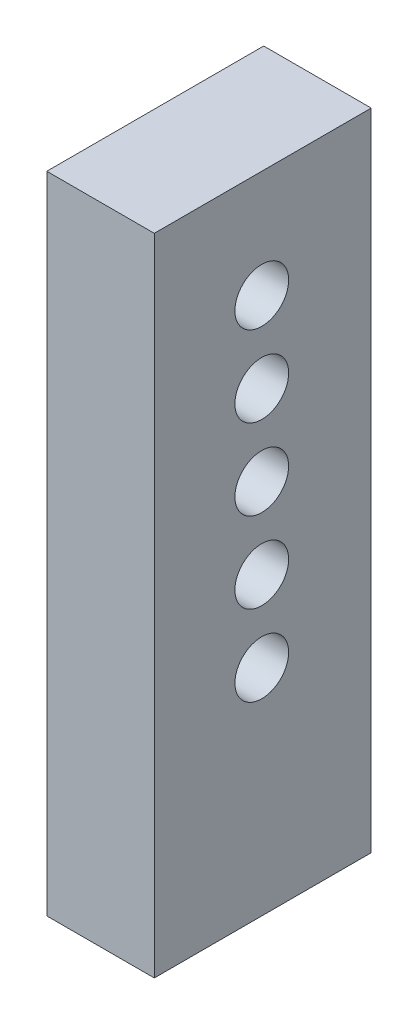
ISO-10303-21;
HEADER;
FILE_DESCRIPTION(('STEP AP214'),'2;1');
FILE_NAME('part.step','',(''),(''),'','','');
FILE_SCHEMA(('AUTOMOTIVE_DESIGN { 1 0 10303 214 1 1 1 1 }'));
ENDSEC;
DATA;
#1=APPLICATION_CONTEXT('core data for automotive mechanical design processes');
#2=APPLICATION_PROTOCOL_DEFINITION('international standard','automotive_design',2000,#1);
#3=PRODUCT_CONTEXT('',#1,'mechanical');
#4=PRODUCT('Part','Part','',(#3));
#5=PRODUCT_RELATED_PRODUCT_CATEGORY('part','',(#4));
#6=PRODUCT_DEFINITION_FORMATION('','',#4);
#7=PRODUCT_DEFINITION_CONTEXT('part definition',#1,'design');
#8=PRODUCT_DEFINITION('design','',#6,#7);
#9=PRODUCT_DEFINITION_SHAPE('','',#8);
#10=(LENGTH_UNIT() NAMED_UNIT(*) SI_UNIT(.MILLI.,.METRE.));
#11=(NAMED_UNIT(*) PLANE_ANGLE_UNIT() SI_UNIT($,.RADIAN.));
#12=(NAMED_UNIT(*) SI_UNIT($,.STERADIAN.) SOLID_ANGLE_UNIT());
#13=UNCERTAINTY_MEASURE_WITH_UNIT(LENGTH_MEASURE(1.E-05),#10,'distance_accuracy_value','');
#14=(GEOMETRIC_REPRESENTATION_CONTEXT(3) GLOBAL_UNCERTAINTY_ASSIGNED_CONTEXT((#13)) GLOBAL_UNIT_ASSIGNED_CONTEXT((#10,
#11,#12)) REPRESENTATION_CONTEXT('',''));
#15=CARTESIAN_POINT('',(0.,0.,0.));
#16=DIRECTION('',(0.,0.,1.));
#17=DIRECTION('',(1.,0.,0.));
#18=AXIS2_PLACEMENT_3D('',#15,#16,#17);
#19=CARTESIAN_POINT('',(25.4,0.,0.));
#20=DIRECTION('',(-1.,0.,0.));
#21=DIRECTION('',(0.,0.,1.));
#22=AXIS2_PLACEMENT_3D('',#19,#20,#21);
#23=PLANE('',#22);
#24=DIRECTION('',(0.,1.,0.));
#25=VECTOR('',#24,1.);
#26=CARTESIAN_POINT('',(25.4,0.,50.3395693192298));
#27=LINE('',#26,#25);
#28=CARTESIAN_POINT('',(25.4,0.,50.3395693192298));
#29=VERTEX_POINT('',#28);
#30=CARTESIAN_POINT('',(25.4,152.4,50.3395693192298));
#31=VERTEX_POINT('',#30);
#32=EDGE_CURVE('E85',#29,#31,#27,.T.);
#33=ORIENTED_EDGE('',*,*,#32,.T.);
#34=DIRECTION('',(0.,0.,1.));
#35=VECTOR('',#34,1.);
#36=CARTESIAN_POINT('',(25.4,152.4,101.6));
#37=LINE('',#36,#35);
#38=CARTESIAN_POINT('',(25.4,152.4,101.6));
#39=VERTEX_POINT('',#38);
#40=EDGE_CURVE('E80',#31,#39,#37,.T.);
#41=ORIENTED_EDGE('',*,*,#40,.T.);
#42=DIRECTION('',(0.,-1.,0.));
#43=VECTOR('',#42,1.);
#44=CARTESIAN_POINT('',(25.4,152.4,101.6));
#45=LINE('',#44,#43);
#46=CARTESIAN_POINT('',(25.4,0.,101.6));
#47=VERTEX_POINT('',#46);
#48=EDGE_CURVE('E83',#39,#47,#45,.T.);
#49=ORIENTED_EDGE('',*,*,#48,.T.);
#50=DIRECTION('',(0.,0.,-1.));
#51=VECTOR('',#50,1.);
#52=CARTESIAN_POINT('',(25.4,0.,101.6));
#53=LINE('',#52,#51);
#54=EDGE_CURVE('E50',#47,#29,#53,.T.);
#55=ORIENTED_EDGE('',*,*,#54,.T.);
#56=EDGE_LOOP('',(#33,#41,#49,#55));
#57=FACE_BOUND('',#56,.T.);
#58=CARTESIAN_POINT('',(25.4,50.8,76.2));
#59=DIRECTION('',(1.,0.,0.));
#60=DIRECTION('',(0.,0.,-1.));
#61=AXIS2_PLACEMENT_3D('',#58,#59,#60);
#62=CIRCLE('',#61,6.35);
#63=CARTESIAN_POINT('',(25.4,50.8,69.85));
#64=VERTEX_POINT('',#63);
#65=EDGE_CURVE('E100',#64,#64,#62,.T.);
#66=ORIENTED_EDGE('',*,*,#65,.F.);
#67=EDGE_LOOP('',(#66));
#68=FACE_BOUND('',#67,.T.);
#69=CARTESIAN_POINT('',(25.4,69.85,76.2));
#70=DIRECTION('',(1.,0.,0.));
#71=DIRECTION('',(0.,0.,-1.));
#72=AXIS2_PLACEMENT_3D('',#69,#70,#71);
#73=CIRCLE('',#72,6.34999999999999);
#74=CARTESIAN_POINT('',(25.4,69.85,69.85));
#75=VERTEX_POINT('',#74);
#76=EDGE_CURVE('E115',#75,#75,#73,.T.);
#77=ORIENTED_EDGE('',*,*,#76,.F.);
#78=EDGE_LOOP('',(#77));
#79=FACE_BOUND('',#78,.T.);
#80=CARTESIAN_POINT('',(25.4,88.9,76.2));
#81=DIRECTION('',(1.,0.,0.));
#82=DIRECTION('',(0.,0.,-1.));
#83=AXIS2_PLACEMENT_3D('',#80,#81,#82);
#84=CIRCLE('',#83,6.34999999999999);
#85=CARTESIAN_POINT('',(25.4,88.9,69.85));
#86=VERTEX_POINT('',#85);
#87=EDGE_CURVE('E121',#86,#86,#84,.T.);
#88=ORIENTED_EDGE('',*,*,#87,.F.);
#89=EDGE_LOOP('',(#88));
#90=FACE_BOUND('',#89,.T.);
#91=CARTESIAN_POINT('',(25.4,107.95,76.2));
#92=DIRECTION('',(1.,0.,0.));
#93=DIRECTION('',(0.,0.,-1.));
#94=AXIS2_PLACEMENT_3D('',#91,#92,#93);
#95=CIRCLE('',#94,6.34999999999999);
#96=CARTESIAN_POINT('',(25.4,107.95,69.85));
#97=VERTEX_POINT('',#96);
#98=EDGE_CURVE('E127',#97,#97,#95,.T.);
#99=ORIENTED_EDGE('',*,*,#98,.F.);
#100=EDGE_LOOP('',(#99));
#101=FACE_BOUND('',#100,.T.);
#102=CARTESIAN_POINT('',(25.4,127.,76.2));
#103=DIRECTION('',(1.,0.,0.));
#104=DIRECTION('',(0.,0.,-1.));
#105=AXIS2_PLACEMENT_3D('',#102,#103,#104);
#106=CIRCLE('',#105,6.34999999999999);
#107=CARTESIAN_POINT('',(25.4,127.,69.85));
#108=VERTEX_POINT('',#107);
#109=EDGE_CURVE('E133',#108,#108,#106,.T.);
#110=ORIENTED_EDGE('',*,*,#109,.F.);
#111=EDGE_LOOP('',(#110));
#112=FACE_BOUND('',#111,.T.);
#113=ADVANCED_FACE('F33',(#57,#68,#79,#90,#101,#112),#23,.F.);
#114=CARTESIAN_POINT('',(0.,0.,0.));
#115=DIRECTION('',(-1.,0.,0.));
#116=DIRECTION('',(0.,0.,1.));
#117=AXIS2_PLACEMENT_3D('',#114,#115,#116);
#118=PLANE('',#117);
#119=CARTESIAN_POINT('',(0.,107.95,76.2));
#120=DIRECTION('',(1.,0.,0.));
#121=DIRECTION('',(0.,0.,-1.));
#122=AXIS2_PLACEMENT_3D('',#119,#120,#121);
#123=CIRCLE('',#122,6.34999999999999);
#124=CARTESIAN_POINT('',(0.,107.95,69.85));
#125=VERTEX_POINT('',#124);
#126=EDGE_CURVE('E130',#125,#125,#123,.T.);
#127=ORIENTED_EDGE('',*,*,#126,.T.);
#128=EDGE_LOOP('',(#127));
#129=FACE_BOUND('',#128,.T.);
#130=CARTESIAN_POINT('',(0.,69.85,76.2));
#131=DIRECTION('',(1.,0.,0.));
#132=DIRECTION('',(0.,0.,-1.));
#133=AXIS2_PLACEMENT_3D('',#130,#131,#132);
#134=CIRCLE('',#133,6.34999999999999);
#135=CARTESIAN_POINT('',(0.,69.85,69.85));
#136=VERTEX_POINT('',#135);
#137=EDGE_CURVE('E118',#136,#136,#134,.T.);
#138=ORIENTED_EDGE('',*,*,#137,.T.);
#139=EDGE_LOOP('',(#138));
#140=FACE_BOUND('',#139,.T.);
#141=DIRECTION('',(0.,1.,0.));
#142=VECTOR('',#141,1.);
#143=CARTESIAN_POINT('',(0.,0.,50.3395693192298));
#144=LINE('',#143,#142);
#145=CARTESIAN_POINT('',(0.,0.,50.3395693192298));
#146=VERTEX_POINT('',#145);
#147=CARTESIAN_POINT('',(0.,152.4,50.3395693192298));
#148=VERTEX_POINT('',#147);
#149=EDGE_CURVE('E97',#146,#148,#144,.T.);
#150=ORIENTED_EDGE('',*,*,#149,.F.);
#151=DIRECTION('',(0.,0.,-1.));
#152=VECTOR('',#151,1.);
#153=CARTESIAN_POINT('',(0.,0.,101.6));
#154=LINE('',#153,#152);
#155=CARTESIAN_POINT('',(0.,0.,101.6));
#156=VERTEX_POINT('',#155);
#157=EDGE_CURVE('E73',#156,#146,#154,.T.);
#158=ORIENTED_EDGE('',*,*,#157,.F.);
#159=DIRECTION('',(0.,-1.,0.));
#160=VECTOR('',#159,1.);
#161=CARTESIAN_POINT('',(0.,152.4,101.6));
#162=LINE('',#161,#160);
#163=CARTESIAN_POINT('',(0.,152.4,101.6));
#164=VERTEX_POINT('',#163);
#165=EDGE_CURVE('E67',#164,#156,#162,.T.);
#166=ORIENTED_EDGE('',*,*,#165,.F.);
#167=DIRECTION('',(0.,0.,1.));
#168=VECTOR('',#167,1.);
#169=CARTESIAN_POINT('',(0.,152.4,101.6));
#170=LINE('',#169,#168);
#171=EDGE_CURVE('E89',#148,#164,#170,.T.);
#172=ORIENTED_EDGE('',*,*,#171,.F.);
#173=EDGE_LOOP('',(#150,#158,#166,#172));
#174=FACE_BOUND('',#173,.T.);
#175=CARTESIAN_POINT('',(0.,50.8,76.2));
#176=DIRECTION('',(1.,0.,0.));
#177=DIRECTION('',(0.,0.,-1.));
#178=AXIS2_PLACEMENT_3D('',#175,#176,#177);
#179=CIRCLE('',#178,6.35);
#180=CARTESIAN_POINT('',(0.,50.8,69.85));
#181=VERTEX_POINT('',#180);
#182=EDGE_CURVE('E112',#181,#181,#179,.T.);
#183=ORIENTED_EDGE('',*,*,#182,.T.);
#184=EDGE_LOOP('',(#183));
#185=FACE_BOUND('',#184,.T.);
#186=CARTESIAN_POINT('',(0.,88.9,76.2));
#187=DIRECTION('',(1.,0.,0.));
#188=DIRECTION('',(0.,0.,-1.));
#189=AXIS2_PLACEMENT_3D('',#186,#187,#188);
#190=CIRCLE('',#189,6.34999999999999);
#191=CARTESIAN_POINT('',(0.,88.9,69.85));
#192=VERTEX_POINT('',#191);
#193=EDGE_CURVE('E124',#192,#192,#190,.T.);
#194=ORIENTED_EDGE('',*,*,#193,.T.);
#195=EDGE_LOOP('',(#194));
#196=FACE_BOUND('',#195,.T.);
#197=CARTESIAN_POINT('',(0.,127.,76.2));
#198=DIRECTION('',(1.,0.,0.));
#199=DIRECTION('',(0.,0.,-1.));
#200=AXIS2_PLACEMENT_3D('',#197,#198,#199);
#201=CIRCLE('',#200,6.34999999999999);
#202=CARTESIAN_POINT('',(0.,127.,69.85));
#203=VERTEX_POINT('',#202);
#204=EDGE_CURVE('E136',#203,#203,#201,.T.);
#205=ORIENTED_EDGE('',*,*,#204,.T.);
#206=EDGE_LOOP('',(#205));
#207=FACE_BOUND('',#206,.T.);
#208=ADVANCED_FACE('F108',(#129,#140,#174,#185,#196,#207),#118,.T.);
#209=CARTESIAN_POINT('',(25.4,0.,50.3395693192298));
#210=DIRECTION('',(0.,0.,1.));
#211=DIRECTION('',(1.,0.,0.));
#212=AXIS2_PLACEMENT_3D('',#209,#210,#211);
#213=PLANE('',#212);
#214=ORIENTED_EDGE('',*,*,#149,.T.);
#215=DIRECTION('',(-1.,0.,0.));
#216=VECTOR('',#215,1.);
#217=CARTESIAN_POINT('',(25.4,152.4,50.3395693192298));
#218=LINE('',#217,#216);
#219=EDGE_CURVE('E11',#31,#148,#218,.T.);
#220=ORIENTED_EDGE('',*,*,#219,.F.);
#221=ORIENTED_EDGE('',*,*,#32,.F.);
#222=DIRECTION('',(-1.,0.,0.));
#223=VECTOR('',#222,1.);
#224=CARTESIAN_POINT('',(25.4,0.,50.3395693192298));
#225=LINE('',#224,#223);
#226=EDGE_CURVE('E93',#29,#146,#225,.T.);
#227=ORIENTED_EDGE('',*,*,#226,.T.);
#228=EDGE_LOOP('',(#214,#220,#221,#227));
#229=FACE_BOUND('',#228,.T.);
#230=ADVANCED_FACE('F35',(#229),#213,.F.);
#231=CARTESIAN_POINT('',(25.4,152.4,101.6));
#232=DIRECTION('',(0.,-1.,0.));
#233=DIRECTION('',(0.,0.,-1.));
#234=AXIS2_PLACEMENT_3D('',#231,#232,#233);
#235=PLANE('',#234);
#236=ORIENTED_EDGE('',*,*,#171,.T.);
#237=DIRECTION('',(-1.,0.,0.));
#238=VECTOR('',#237,1.);
#239=CARTESIAN_POINT('',(25.4,152.4,101.6));
#240=LINE('',#239,#238);
#241=EDGE_CURVE('E42',#39,#164,#240,.T.);
#242=ORIENTED_EDGE('',*,*,#241,.F.);
#243=ORIENTED_EDGE('',*,*,#40,.F.);
#244=ORIENTED_EDGE('',*,*,#219,.T.);
#245=EDGE_LOOP('',(#236,#242,#243,#244));
#246=FACE_BOUND('',#245,.T.);
#247=ADVANCED_FACE('F88',(#246),#235,.F.);
#248=CARTESIAN_POINT('',(25.4,152.4,101.6));
#249=DIRECTION('',(0.,0.,-1.));
#250=DIRECTION('',(0.,1.,0.));
#251=AXIS2_PLACEMENT_3D('',#248,#249,#250);
#252=PLANE('',#251);
#253=ORIENTED_EDGE('',*,*,#165,.T.);
#254=DIRECTION('',(-1.,0.,0.));
#255=VECTOR('',#254,1.);
#256=CARTESIAN_POINT('',(25.4,0.,101.6));
#257=LINE('',#256,#255);
#258=EDGE_CURVE('E90',#47,#156,#257,.T.);
#259=ORIENTED_EDGE('',*,*,#258,.F.);
#260=ORIENTED_EDGE('',*,*,#48,.F.);
#261=ORIENTED_EDGE('',*,*,#241,.T.);
#262=EDGE_LOOP('',(#253,#259,#260,#261));
#263=FACE_BOUND('',#262,.T.);
#264=ADVANCED_FACE('F91',(#263),#252,.F.);
#265=CARTESIAN_POINT('',(25.4,0.,101.6));
#266=DIRECTION('',(0.,1.,0.));
#267=DIRECTION('',(0.,0.,1.));
#268=AXIS2_PLACEMENT_3D('',#265,#266,#267);
#269=PLANE('',#268);
#270=CARTESIAN_POINT('',(12.7,0.,75.7395693192298));
#271=DIRECTION('',(0.,-1.,0.));
#272=DIRECTION('',(0.,0.,-1.));
#273=AXIS2_PLACEMENT_3D('',#270,#271,#272);
#274=CIRCLE('',#273,2.0193);
#275=CARTESIAN_POINT('',(12.7,0.,73.7202693192298));
#276=VERTEX_POINT('',#275);
#277=EDGE_CURVE('E142',#276,#276,#274,.T.);
#278=ORIENTED_EDGE('',*,*,#277,.F.);
#279=EDGE_LOOP('',(#278));
#280=FACE_BOUND('',#279,.T.);
#281=ORIENTED_EDGE('',*,*,#157,.T.);
#282=ORIENTED_EDGE('',*,*,#226,.F.);
#283=ORIENTED_EDGE('',*,*,#54,.F.);
#284=ORIENTED_EDGE('',*,*,#258,.T.);
#285=EDGE_LOOP('',(#281,#282,#283,#284));
#286=FACE_BOUND('',#285,.T.);
#287=ADVANCED_FACE('F105',(#280,#286),#269,.F.);
#288=CARTESIAN_POINT('',(25.4,50.8,76.2));
#289=DIRECTION('',(-1.,0.,0.));
#290=DIRECTION('',(0.,0.,1.));
#291=AXIS2_PLACEMENT_3D('',#288,#289,#290);
#292=CYLINDRICAL_SURFACE('',#291,6.35);
#293=ORIENTED_EDGE('',*,*,#65,.T.);
#294=EDGE_LOOP('',(#293));
#295=FACE_BOUND('',#294,.T.);
#296=ORIENTED_EDGE('',*,*,#182,.F.);
#297=EDGE_LOOP('',(#296));
#298=FACE_BOUND('',#297,.T.);
#299=ADVANCED_FACE('F158',(#295,#298),#292,.F.);
#300=CARTESIAN_POINT('',(25.4,69.85,76.2));
#301=DIRECTION('',(-1.,0.,0.));
#302=DIRECTION('',(0.,0.,1.));
#303=AXIS2_PLACEMENT_3D('',#300,#301,#302);
#304=CYLINDRICAL_SURFACE('',#303,6.34999999999999);
#305=ORIENTED_EDGE('',*,*,#76,.T.);
#306=EDGE_LOOP('',(#305));
#307=FACE_BOUND('',#306,.T.);
#308=ORIENTED_EDGE('',*,*,#137,.F.);
#309=EDGE_LOOP('',(#308));
#310=FACE_BOUND('',#309,.T.);
#311=ADVANCED_FACE('F164',(#307,#310),#304,.F.);
#312=CARTESIAN_POINT('',(25.4,88.9,76.2));
#313=DIRECTION('',(-1.,0.,0.));
#314=DIRECTION('',(0.,0.,1.));
#315=AXIS2_PLACEMENT_3D('',#312,#313,#314);
#316=CYLINDRICAL_SURFACE('',#315,6.34999999999999);
#317=ORIENTED_EDGE('',*,*,#87,.T.);
#318=EDGE_LOOP('',(#317));
#319=FACE_BOUND('',#318,.T.);
#320=ORIENTED_EDGE('',*,*,#193,.F.);
#321=EDGE_LOOP('',(#320));
#322=FACE_BOUND('',#321,.T.);
#323=ADVANCED_FACE('F178',(#319,#322),#316,.F.);
#324=CARTESIAN_POINT('',(25.4,107.95,76.2));
#325=DIRECTION('',(-1.,0.,0.));
#326=DIRECTION('',(0.,0.,1.));
#327=AXIS2_PLACEMENT_3D('',#324,#325,#326);
#328=CYLINDRICAL_SURFACE('',#327,6.34999999999999);
#329=ORIENTED_EDGE('',*,*,#98,.T.);
#330=EDGE_LOOP('',(#329));
#331=FACE_BOUND('',#330,.T.);
#332=ORIENTED_EDGE('',*,*,#126,.F.);
#333=EDGE_LOOP('',(#332));
#334=FACE_BOUND('',#333,.T.);
#335=ADVANCED_FACE('F182',(#331,#334),#328,.F.);
#336=CARTESIAN_POINT('',(25.4,127.,76.2));
#337=DIRECTION('',(-1.,0.,0.));
#338=DIRECTION('',(0.,0.,1.));
#339=AXIS2_PLACEMENT_3D('',#336,#337,#338);
#340=CYLINDRICAL_SURFACE('',#339,6.34999999999999);
#341=ORIENTED_EDGE('',*,*,#109,.T.);
#342=EDGE_LOOP('',(#341));
#343=FACE_BOUND('',#342,.T.);
#344=ORIENTED_EDGE('',*,*,#204,.F.);
#345=EDGE_LOOP('',(#344));
#346=FACE_BOUND('',#345,.T.);
#347=ADVANCED_FACE('F153',(#343,#346),#340,.F.);
#348=CARTESIAN_POINT('',(12.7,25.4,75.7395693192298));
#349=DIRECTION('',(0.,-1.,0.));
#350=DIRECTION('',(0.,0.,-1.));
#351=AXIS2_PLACEMENT_3D('',#348,#349,#350);
#352=CYLINDRICAL_SURFACE('',#351,2.0193);
#353=CARTESIAN_POINT('',(12.7,25.4,75.7395693192298));
#354=DIRECTION('',(0.,-1.,0.));
#355=DIRECTION('',(0.,0.,-1.));
#356=AXIS2_PLACEMENT_3D('',#353,#354,#355);
#357=CIRCLE('',#356,2.0193);
#358=CARTESIAN_POINT('',(12.7,25.4,73.7202693192298));
#359=VERTEX_POINT('',#358);
#360=EDGE_CURVE('E139',#359,#359,#357,.T.);
#361=ORIENTED_EDGE('',*,*,#360,.F.);
#362=EDGE_LOOP('',(#361));
#363=FACE_BOUND('',#362,.T.);
#364=ORIENTED_EDGE('',*,*,#277,.T.);
#365=EDGE_LOOP('',(#364));
#366=FACE_BOUND('',#365,.T.);
#367=ADVANCED_FACE('F150',(#363,#366),#352,.F.);
#368=CARTESIAN_POINT('',(12.7,25.4,75.7395693192298));
#369=DIRECTION('',(0.,-1.,0.));
#370=DIRECTION('',(0.,0.,-1.));
#371=AXIS2_PLACEMENT_3D('',#368,#369,#370);
#372=PLANE('',#371);
#373=ORIENTED_EDGE('',*,*,#360,.T.);
#374=EDGE_LOOP('',(#373));
#375=FACE_BOUND('',#374,.T.);
#376=ADVANCED_FACE('F148',(#375),#372,.T.);
#377=CLOSED_SHELL('',(#113,#208,#230,#247,#264,#287,#299,#311,#323,#335,#347,#367,#376));
#378=MANIFOLD_SOLID_BREP('B2',#377);
#379=ADVANCED_BREP_SHAPE_REPRESENTATION('',(#18,#378),#14);
#380=SHAPE_DEFINITION_REPRESENTATION(#9,#379);
ENDSEC;
END-ISO-10303-21;
